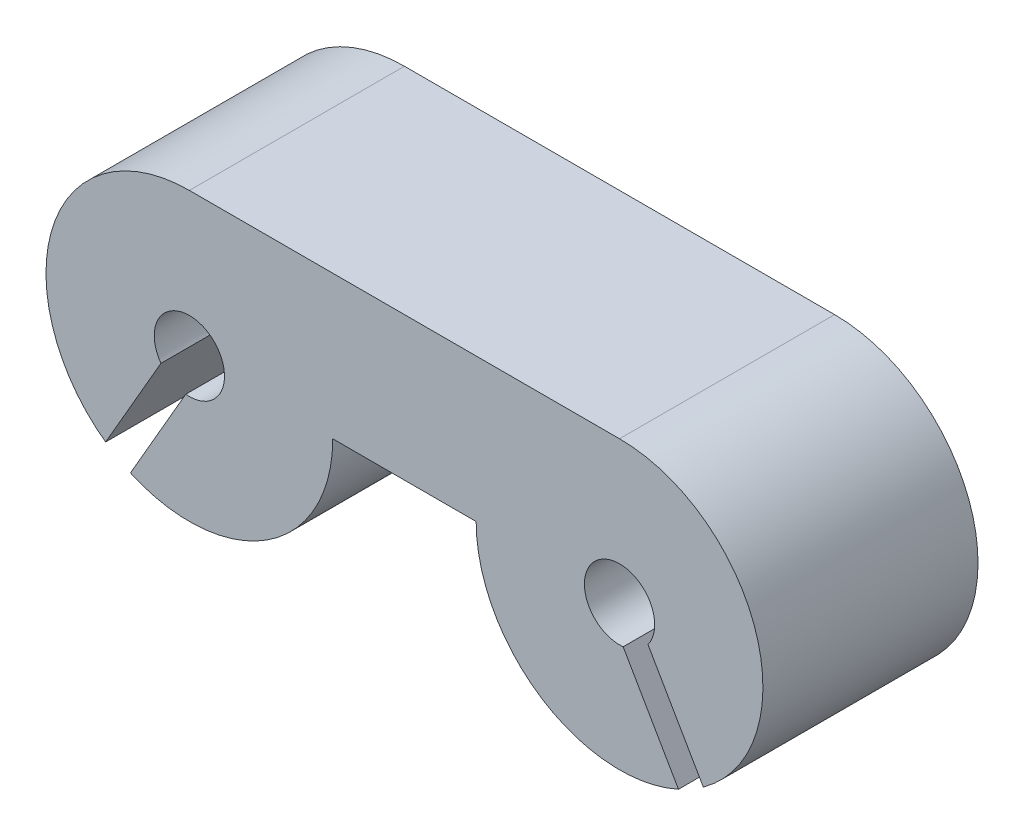
ISO-10303-21;
HEADER;
FILE_DESCRIPTION(('STEP AP214'),'2;1');
FILE_NAME('part.step','',(''),(''),'','','');
FILE_SCHEMA(('AUTOMOTIVE_DESIGN { 1 0 10303 214 1 1 1 1 }'));
ENDSEC;
DATA;
#1=APPLICATION_CONTEXT('core data for automotive mechanical design processes');
#2=APPLICATION_PROTOCOL_DEFINITION('international standard','automotive_design',2000,#1);
#3=PRODUCT_CONTEXT('',#1,'mechanical');
#4=PRODUCT('Part','Part','',(#3));
#5=PRODUCT_RELATED_PRODUCT_CATEGORY('part','',(#4));
#6=PRODUCT_DEFINITION_FORMATION('','',#4);
#7=PRODUCT_DEFINITION_CONTEXT('part definition',#1,'design');
#8=PRODUCT_DEFINITION('design','',#6,#7);
#9=PRODUCT_DEFINITION_SHAPE('','',#8);
#10=(LENGTH_UNIT() NAMED_UNIT(*) SI_UNIT(.MILLI.,.METRE.));
#11=(NAMED_UNIT(*) PLANE_ANGLE_UNIT() SI_UNIT($,.RADIAN.));
#12=(NAMED_UNIT(*) SI_UNIT($,.STERADIAN.) SOLID_ANGLE_UNIT());
#13=UNCERTAINTY_MEASURE_WITH_UNIT(LENGTH_MEASURE(1.E-05),#10,'distance_accuracy_value','');
#14=(GEOMETRIC_REPRESENTATION_CONTEXT(3) GLOBAL_UNCERTAINTY_ASSIGNED_CONTEXT((#13)) GLOBAL_UNIT_ASSIGNED_CONTEXT((#10,
#11,#12)) REPRESENTATION_CONTEXT('',''));
#15=CARTESIAN_POINT('',(0.,0.,0.));
#16=DIRECTION('',(0.,0.,1.));
#17=DIRECTION('',(1.,0.,0.));
#18=AXIS2_PLACEMENT_3D('',#15,#16,#17);
#19=CARTESIAN_POINT('',(15.,0.,15.));
#20=DIRECTION('',(0.,0.,-1.));
#21=DIRECTION('',(-1.,0.,0.));
#22=AXIS2_PLACEMENT_3D('',#19,#20,#21);
#23=CYLINDRICAL_SURFACE('',#22,10.);
#24=CARTESIAN_POINT('',(15.,0.,0.));
#25=DIRECTION('',(0.,0.,1.));
#26=DIRECTION('',(1.,0.,0.));
#27=AXIS2_PLACEMENT_3D('',#24,#25,#26);
#28=CIRCLE('',#27,10.);
#29=CARTESIAN_POINT('',(5.,0.,0.));
#30=VERTEX_POINT('',#29);
#31=CARTESIAN_POINT('',(19.1089117817486,-9.11684396980705,0.));
#32=VERTEX_POINT('',#31);
#33=EDGE_CURVE('E168',#30,#32,#28,.T.);
#34=ORIENTED_EDGE('',*,*,#33,.T.);
#35=DIRECTION('',(0.,0.,-1.));
#36=VECTOR('',#35,1.);
#37=CARTESIAN_POINT('',(19.1089117817486,-9.11684396980705,15.));
#38=LINE('',#37,#36);
#39=CARTESIAN_POINT('',(19.1089117817486,-9.11684396980705,15.));
#40=VERTEX_POINT('',#39);
#41=EDGE_CURVE('E206',#32,#40,#38,.F.);
#42=ORIENTED_EDGE('',*,*,#41,.T.);
#43=CARTESIAN_POINT('',(15.,0.,15.));
#44=DIRECTION('',(0.,0.,1.));
#45=DIRECTION('',(1.,0.,0.));
#46=AXIS2_PLACEMENT_3D('',#43,#44,#45);
#47=CIRCLE('',#46,10.);
#48=CARTESIAN_POINT('',(5.,0.,15.));
#49=VERTEX_POINT('',#48);
#50=EDGE_CURVE('E132',#49,#40,#47,.T.);
#51=ORIENTED_EDGE('',*,*,#50,.F.);
#52=DIRECTION('',(0.,0.,-1.));
#53=VECTOR('',#52,1.);
#54=CARTESIAN_POINT('',(5.,0.,15.));
#55=LINE('',#54,#53);
#56=EDGE_CURVE('E174',#49,#30,#55,.T.);
#57=ORIENTED_EDGE('',*,*,#56,.T.);
#58=EDGE_LOOP('',(#34,#42,#51,#57));
#59=FACE_BOUND('',#58,.T.);
#60=ADVANCED_FACE('F33',(#59),#23,.T.);
#61=CARTESIAN_POINT('',(-15.,0.,15.));
#62=DIRECTION('',(0.,0.,-1.));
#63=DIRECTION('',(-1.,0.,0.));
#64=AXIS2_PLACEMENT_3D('',#61,#62,#63);
#65=CYLINDRICAL_SURFACE('',#64,10.);
#66=CARTESIAN_POINT('',(-15.,0.,15.));
#67=DIRECTION('',(0.,0.,1.));
#68=DIRECTION('',(1.,0.,0.));
#69=AXIS2_PLACEMENT_3D('',#66,#67,#68);
#70=CIRCLE('',#69,10.);
#71=CARTESIAN_POINT('',(-19.1089117817487,-9.11684396980703,15.));
#72=VERTEX_POINT('',#71);
#73=CARTESIAN_POINT('',(-5.,0.,15.));
#74=VERTEX_POINT('',#73);
#75=EDGE_CURVE('E152',#72,#74,#70,.T.);
#76=ORIENTED_EDGE('',*,*,#75,.F.);
#77=DIRECTION('',(0.,0.,-1.));
#78=VECTOR('',#77,1.);
#79=CARTESIAN_POINT('',(-19.1089117817487,-9.11684396980702,15.));
#80=LINE('',#79,#78);
#81=CARTESIAN_POINT('',(-19.1089117817487,-9.11684396980703,0.));
#82=VERTEX_POINT('',#81);
#83=EDGE_CURVE('E136',#72,#82,#80,.T.);
#84=ORIENTED_EDGE('',*,*,#83,.T.);
#85=CARTESIAN_POINT('',(-15.,0.,0.));
#86=DIRECTION('',(0.,0.,1.));
#87=DIRECTION('',(1.,0.,0.));
#88=AXIS2_PLACEMENT_3D('',#85,#86,#87);
#89=CIRCLE('',#88,10.);
#90=CARTESIAN_POINT('',(-5.,0.,0.));
#91=VERTEX_POINT('',#90);
#92=EDGE_CURVE('E147',#82,#91,#89,.T.);
#93=ORIENTED_EDGE('',*,*,#92,.T.);
#94=DIRECTION('',(0.,0.,-1.));
#95=VECTOR('',#94,1.);
#96=CARTESIAN_POINT('',(-5.,0.,15.));
#97=LINE('',#96,#95);
#98=EDGE_CURVE('E177',#74,#91,#97,.T.);
#99=ORIENTED_EDGE('',*,*,#98,.F.);
#100=EDGE_LOOP('',(#76,#84,#93,#99));
#101=FACE_BOUND('',#100,.T.);
#102=ADVANCED_FACE('F234',(#101),#65,.T.);
#103=CARTESIAN_POINT('',(-15.,10.,0.));
#104=VERTEX_POINT('',#103);
#105=CARTESIAN_POINT('',(-20.8409625893176,-8.11684396980702,0.));
#106=VERTEX_POINT('',#105);
#107=EDGE_CURVE('E162',#104,#106,#89,.T.);
#108=ORIENTED_EDGE('',*,*,#107,.T.);
#109=DIRECTION('',(0.,0.,-1.));
#110=VECTOR('',#109,1.);
#111=CARTESIAN_POINT('',(-20.8409625893176,-8.11684396980702,15.));
#112=LINE('',#111,#110);
#113=CARTESIAN_POINT('',(-20.8409625893176,-8.11684396980702,15.));
#114=VERTEX_POINT('',#113);
#115=EDGE_CURVE('E141',#106,#114,#112,.F.);
#116=ORIENTED_EDGE('',*,*,#115,.T.);
#117=CARTESIAN_POINT('',(-15.,10.,15.));
#118=VERTEX_POINT('',#117);
#119=EDGE_CURVE('E154',#118,#114,#70,.T.);
#120=ORIENTED_EDGE('',*,*,#119,.F.);
#121=DIRECTION('',(0.,0.,-1.));
#122=VECTOR('',#121,1.);
#123=CARTESIAN_POINT('',(-15.,10.,15.));
#124=LINE('',#123,#122);
#125=EDGE_CURVE('E180',#118,#104,#124,.T.);
#126=ORIENTED_EDGE('',*,*,#125,.T.);
#127=EDGE_LOOP('',(#108,#116,#120,#126));
#128=FACE_BOUND('',#127,.T.);
#129=ADVANCED_FACE('F35',(#128),#65,.T.);
#130=CARTESIAN_POINT('',(-5.,0.,15.));
#131=DIRECTION('',(0.,1.,0.));
#132=DIRECTION('',(0.,0.,1.));
#133=AXIS2_PLACEMENT_3D('',#130,#131,#132);
#134=PLANE('',#133);
#135=DIRECTION('',(1.,0.,0.));
#136=VECTOR('',#135,1.);
#137=CARTESIAN_POINT('',(-5.,0.,0.));
#138=LINE('',#137,#136);
#139=EDGE_CURVE('E165',#91,#30,#138,.T.);
#140=ORIENTED_EDGE('',*,*,#139,.T.);
#141=ORIENTED_EDGE('',*,*,#56,.F.);
#142=DIRECTION('',(1.,0.,0.));
#143=VECTOR('',#142,1.);
#144=CARTESIAN_POINT('',(-5.,0.,15.));
#145=LINE('',#144,#143);
#146=EDGE_CURVE('E157',#74,#49,#145,.T.);
#147=ORIENTED_EDGE('',*,*,#146,.F.);
#148=ORIENTED_EDGE('',*,*,#98,.T.);
#149=EDGE_LOOP('',(#140,#141,#147,#148));
#150=FACE_BOUND('',#149,.T.);
#151=ADVANCED_FACE('F230',(#150),#134,.F.);
#152=CARTESIAN_POINT('',(20.8409625893175,-8.11684396980705,15.));
#153=VERTEX_POINT('',#152);
#154=CARTESIAN_POINT('',(15.,10.,15.));
#155=VERTEX_POINT('',#154);
#156=EDGE_CURVE('E159',#153,#155,#47,.T.);
#157=ORIENTED_EDGE('',*,*,#156,.F.);
#158=DIRECTION('',(0.,0.,-1.));
#159=VECTOR('',#158,1.);
#160=CARTESIAN_POINT('',(20.8409625893175,-8.11684396980705,15.));
#161=LINE('',#160,#159);
#162=CARTESIAN_POINT('',(20.8409625893175,-8.11684396980705,0.));
#163=VERTEX_POINT('',#162);
#164=EDGE_CURVE('E216',#153,#163,#161,.T.);
#165=ORIENTED_EDGE('',*,*,#164,.T.);
#166=CARTESIAN_POINT('',(15.,10.,0.));
#167=VERTEX_POINT('',#166);
#168=EDGE_CURVE('E167',#163,#167,#28,.T.);
#169=ORIENTED_EDGE('',*,*,#168,.T.);
#170=DIRECTION('',(0.,0.,-1.));
#171=VECTOR('',#170,1.);
#172=CARTESIAN_POINT('',(15.,10.,15.));
#173=LINE('',#172,#171);
#174=EDGE_CURVE('E161',#155,#167,#173,.T.);
#175=ORIENTED_EDGE('',*,*,#174,.F.);
#176=EDGE_LOOP('',(#157,#165,#169,#175));
#177=FACE_BOUND('',#176,.T.);
#178=ADVANCED_FACE('F249',(#177),#23,.T.);
#179=CARTESIAN_POINT('',(5.,10.,15.));
#180=DIRECTION('',(0.,-1.,0.));
#181=DIRECTION('',(1.,0.,0.));
#182=AXIS2_PLACEMENT_3D('',#179,#180,#181);
#183=PLANE('',#182);
#184=DIRECTION('',(-1.,0.,0.));
#185=VECTOR('',#184,1.);
#186=CARTESIAN_POINT('',(5.,10.,0.));
#187=LINE('',#186,#185);
#188=EDGE_CURVE('E153',#167,#104,#187,.T.);
#189=ORIENTED_EDGE('',*,*,#188,.T.);
#190=ORIENTED_EDGE('',*,*,#125,.F.);
#191=DIRECTION('',(-1.,0.,0.));
#192=VECTOR('',#191,1.);
#193=CARTESIAN_POINT('',(-5.,10.,15.));
#194=LINE('',#193,#192);
#195=EDGE_CURVE('E150',#155,#118,#194,.T.);
#196=ORIENTED_EDGE('',*,*,#195,.F.);
#197=ORIENTED_EDGE('',*,*,#174,.T.);
#198=EDGE_LOOP('',(#189,#190,#196,#197));
#199=FACE_BOUND('',#198,.T.);
#200=ADVANCED_FACE('F255',(#199),#183,.F.);
#201=CARTESIAN_POINT('',(15.,0.,15.));
#202=DIRECTION('',(0.,0.,1.));
#203=DIRECTION('',(1.,0.,0.));
#204=AXIS2_PLACEMENT_3D('',#201,#202,#203);
#205=PLANE('',#204);
#206=DIRECTION('',(0.499999999999998,-0.86602540378444,0.));
#207=VECTOR('',#206,1.);
#208=CARTESIAN_POINT('',(14.1339745962156,-0.499999999999997,15.));
#209=LINE('',#208,#207);
#210=CARTESIAN_POINT('',(15.2522880585328,-2.43697573552175,15.));
#211=VERTEX_POINT('',#210);
#212=EDGE_CURVE('E120',#211,#40,#209,.T.);
#213=ORIENTED_EDGE('',*,*,#212,.F.);
#214=CARTESIAN_POINT('',(15.,0.,15.));
#215=DIRECTION('',(0.,0.,1.));
#216=DIRECTION('',(1.,0.,0.));
#217=AXIS2_PLACEMENT_3D('',#214,#215,#216);
#218=CIRCLE('',#217,2.45);
#219=CARTESIAN_POINT('',(16.9843388661017,-1.43697573552175,15.));
#220=VERTEX_POINT('',#219);
#221=EDGE_CURVE('E130',#220,#211,#218,.T.);
#222=ORIENTED_EDGE('',*,*,#221,.F.);
#223=DIRECTION('',(-0.499999999999998,0.86602540378444,0.));
#224=VECTOR('',#223,1.);
#225=CARTESIAN_POINT('',(15.8660254037844,0.499999999999998,15.));
#226=LINE('',#225,#224);
#227=EDGE_CURVE('E48',#153,#220,#226,.T.);
#228=ORIENTED_EDGE('',*,*,#227,.F.);
#229=ORIENTED_EDGE('',*,*,#156,.T.);
#230=ORIENTED_EDGE('',*,*,#195,.T.);
#231=ORIENTED_EDGE('',*,*,#119,.T.);
#232=DIRECTION('',(-0.500000000000004,-0.866025403784436,0.));
#233=VECTOR('',#232,1.);
#234=CARTESIAN_POINT('',(-15.8660254037844,0.500000000000004,15.));
#235=LINE('',#234,#233);
#236=CARTESIAN_POINT('',(-16.9843388661017,-1.43697573552174,15.));
#237=VERTEX_POINT('',#236);
#238=EDGE_CURVE('E198',#237,#114,#235,.T.);
#239=ORIENTED_EDGE('',*,*,#238,.F.);
#240=CARTESIAN_POINT('',(-15.,0.,15.));
#241=DIRECTION('',(0.,0.,1.));
#242=DIRECTION('',(1.,0.,0.));
#243=AXIS2_PLACEMENT_3D('',#240,#241,#242);
#244=CIRCLE('',#243,2.45);
#245=CARTESIAN_POINT('',(-15.2522880585328,-2.43697573552174,15.));
#246=VERTEX_POINT('',#245);
#247=EDGE_CURVE('E138',#246,#237,#244,.T.);
#248=ORIENTED_EDGE('',*,*,#247,.F.);
#249=DIRECTION('',(0.500000000000004,0.866025403784436,0.));
#250=VECTOR('',#249,1.);
#251=CARTESIAN_POINT('',(-14.1339745962156,-0.500000000000002,15.));
#252=LINE('',#251,#250);
#253=EDGE_CURVE('E196',#72,#246,#252,.T.);
#254=ORIENTED_EDGE('',*,*,#253,.F.);
#255=ORIENTED_EDGE('',*,*,#75,.T.);
#256=ORIENTED_EDGE('',*,*,#146,.T.);
#257=ORIENTED_EDGE('',*,*,#50,.T.);
#258=EDGE_LOOP('',(#213,#222,#228,#229,#230,#231,#239,#248,#254,#255,#256,#257));
#259=FACE_BOUND('',#258,.T.);
#260=ADVANCED_FACE('F129',(#259),#205,.T.);
#261=CARTESIAN_POINT('',(15.,0.,0.));
#262=DIRECTION('',(0.,0.,1.));
#263=DIRECTION('',(1.,0.,0.));
#264=AXIS2_PLACEMENT_3D('',#261,#262,#263);
#265=PLANE('',#264);
#266=CARTESIAN_POINT('',(15.,0.,0.));
#267=DIRECTION('',(0.,0.,1.));
#268=DIRECTION('',(1.,0.,0.));
#269=AXIS2_PLACEMENT_3D('',#266,#267,#268);
#270=CIRCLE('',#269,2.45);
#271=CARTESIAN_POINT('',(16.9843388661017,-1.43697573552175,0.));
#272=VERTEX_POINT('',#271);
#273=CARTESIAN_POINT('',(15.2522880585328,-2.43697573552175,0.));
#274=VERTEX_POINT('',#273);
#275=EDGE_CURVE('E135',#272,#274,#270,.T.);
#276=ORIENTED_EDGE('',*,*,#275,.T.);
#277=DIRECTION('',(0.499999999999998,-0.86602540378444,0.));
#278=VECTOR('',#277,1.);
#279=CARTESIAN_POINT('',(14.1339745962156,-0.499999999999997,0.));
#280=LINE('',#279,#278);
#281=EDGE_CURVE('E56',#274,#32,#280,.T.);
#282=ORIENTED_EDGE('',*,*,#281,.T.);
#283=ORIENTED_EDGE('',*,*,#33,.F.);
#284=ORIENTED_EDGE('',*,*,#139,.F.);
#285=ORIENTED_EDGE('',*,*,#92,.F.);
#286=DIRECTION('',(0.500000000000004,0.866025403784436,0.));
#287=VECTOR('',#286,1.);
#288=CARTESIAN_POINT('',(-14.1339745962156,-0.500000000000002,0.));
#289=LINE('',#288,#287);
#290=CARTESIAN_POINT('',(-15.2522880585328,-2.43697573552174,0.));
#291=VERTEX_POINT('',#290);
#292=EDGE_CURVE('E202',#82,#291,#289,.T.);
#293=ORIENTED_EDGE('',*,*,#292,.T.);
#294=CARTESIAN_POINT('',(-15.,0.,0.));
#295=DIRECTION('',(0.,0.,1.));
#296=DIRECTION('',(1.,0.,0.));
#297=AXIS2_PLACEMENT_3D('',#294,#295,#296);
#298=CIRCLE('',#297,2.45);
#299=CARTESIAN_POINT('',(-16.9843388661017,-1.43697573552174,0.));
#300=VERTEX_POINT('',#299);
#301=EDGE_CURVE('E144',#291,#300,#298,.T.);
#302=ORIENTED_EDGE('',*,*,#301,.T.);
#303=DIRECTION('',(-0.500000000000004,-0.866025403784436,0.));
#304=VECTOR('',#303,1.);
#305=CARTESIAN_POINT('',(-15.8660254037844,0.500000000000004,0.));
#306=LINE('',#305,#304);
#307=EDGE_CURVE('E204',#300,#106,#306,.T.);
#308=ORIENTED_EDGE('',*,*,#307,.T.);
#309=ORIENTED_EDGE('',*,*,#107,.F.);
#310=ORIENTED_EDGE('',*,*,#188,.F.);
#311=ORIENTED_EDGE('',*,*,#168,.F.);
#312=DIRECTION('',(-0.499999999999998,0.86602540378444,0.));
#313=VECTOR('',#312,1.);
#314=CARTESIAN_POINT('',(15.8660254037844,0.499999999999998,0.));
#315=LINE('',#314,#313);
#316=EDGE_CURVE('E219',#163,#272,#315,.T.);
#317=ORIENTED_EDGE('',*,*,#316,.T.);
#318=EDGE_LOOP('',(#276,#282,#283,#284,#285,#293,#302,#308,#309,#310,#311,#317));
#319=FACE_BOUND('',#318,.T.);
#320=ADVANCED_FACE('F224',(#319),#265,.F.);
#321=CARTESIAN_POINT('',(-15.,0.,0.));
#322=DIRECTION('',(0.,0.,1.));
#323=DIRECTION('',(1.,0.,0.));
#324=AXIS2_PLACEMENT_3D('',#321,#322,#323);
#325=CYLINDRICAL_SURFACE('',#324,2.45);
#326=ORIENTED_EDGE('',*,*,#301,.F.);
#327=DIRECTION('',(0.,0.,1.));
#328=VECTOR('',#327,1.);
#329=CARTESIAN_POINT('',(-15.2522880585328,-2.43697573552174,0.));
#330=LINE('',#329,#328);
#331=EDGE_CURVE('E186',#291,#246,#330,.T.);
#332=ORIENTED_EDGE('',*,*,#331,.T.);
#333=ORIENTED_EDGE('',*,*,#247,.T.);
#334=DIRECTION('',(0.,0.,1.));
#335=VECTOR('',#334,1.);
#336=CARTESIAN_POINT('',(-16.9843388661017,-1.43697573552174,0.));
#337=LINE('',#336,#335);
#338=EDGE_CURVE('E183',#237,#300,#337,.F.);
#339=ORIENTED_EDGE('',*,*,#338,.T.);
#340=EDGE_LOOP('',(#326,#332,#333,#339));
#341=FACE_BOUND('',#340,.T.);
#342=ADVANCED_FACE('F191',(#341),#325,.F.);
#343=CARTESIAN_POINT('',(15.,0.,0.));
#344=DIRECTION('',(0.,0.,1.));
#345=DIRECTION('',(1.,0.,0.));
#346=AXIS2_PLACEMENT_3D('',#343,#344,#345);
#347=CYLINDRICAL_SURFACE('',#346,2.45);
#348=ORIENTED_EDGE('',*,*,#221,.T.);
#349=DIRECTION('',(0.,0.,1.));
#350=VECTOR('',#349,1.);
#351=CARTESIAN_POINT('',(15.2522880585328,-2.43697573552175,0.));
#352=LINE('',#351,#350);
#353=EDGE_CURVE('E11',#211,#274,#352,.F.);
#354=ORIENTED_EDGE('',*,*,#353,.T.);
#355=ORIENTED_EDGE('',*,*,#275,.F.);
#356=DIRECTION('',(0.,0.,1.));
#357=VECTOR('',#356,1.);
#358=CARTESIAN_POINT('',(16.9843388661017,-1.43697573552175,0.));
#359=LINE('',#358,#357);
#360=EDGE_CURVE('E41',#272,#220,#359,.T.);
#361=ORIENTED_EDGE('',*,*,#360,.T.);
#362=EDGE_LOOP('',(#348,#354,#355,#361));
#363=FACE_BOUND('',#362,.T.);
#364=ADVANCED_FACE('F134',(#363),#347,.F.);
#365=CARTESIAN_POINT('',(-15.8660254037844,0.500000000000004,0.));
#366=DIRECTION('',(-0.866025403784436,0.500000000000004,0.));
#367=DIRECTION('',(-0.500000000000004,-0.866025403784437,0.));
#368=AXIS2_PLACEMENT_3D('',#365,#366,#367);
#369=PLANE('',#368);
#370=ORIENTED_EDGE('',*,*,#307,.F.);
#371=ORIENTED_EDGE('',*,*,#338,.F.);
#372=ORIENTED_EDGE('',*,*,#238,.T.);
#373=ORIENTED_EDGE('',*,*,#115,.F.);
#374=EDGE_LOOP('',(#370,#371,#372,#373));
#375=FACE_BOUND('',#374,.T.);
#376=ADVANCED_FACE('F238',(#375),#369,.F.);
#377=CARTESIAN_POINT('',(-14.1339745962156,-0.500000000000002,0.));
#378=DIRECTION('',(0.866025403784436,-0.500000000000004,0.));
#379=DIRECTION('',(0.500000000000004,0.866025403784436,0.));
#380=AXIS2_PLACEMENT_3D('',#377,#378,#379);
#381=PLANE('',#380);
#382=ORIENTED_EDGE('',*,*,#253,.T.);
#383=ORIENTED_EDGE('',*,*,#331,.F.);
#384=ORIENTED_EDGE('',*,*,#292,.F.);
#385=ORIENTED_EDGE('',*,*,#83,.F.);
#386=EDGE_LOOP('',(#382,#383,#384,#385));
#387=FACE_BOUND('',#386,.T.);
#388=ADVANCED_FACE('F235',(#387),#381,.F.);
#389=CARTESIAN_POINT('',(15.8660254037844,0.499999999999998,0.));
#390=DIRECTION('',(0.86602540378444,0.499999999999998,0.));
#391=DIRECTION('',(-0.499999999999998,0.86602540378444,0.));
#392=AXIS2_PLACEMENT_3D('',#389,#390,#391);
#393=PLANE('',#392);
#394=ORIENTED_EDGE('',*,*,#227,.T.);
#395=ORIENTED_EDGE('',*,*,#360,.F.);
#396=ORIENTED_EDGE('',*,*,#316,.F.);
#397=ORIENTED_EDGE('',*,*,#164,.F.);
#398=EDGE_LOOP('',(#394,#395,#396,#397));
#399=FACE_BOUND('',#398,.T.);
#400=ADVANCED_FACE('F237',(#399),#393,.F.);
#401=CARTESIAN_POINT('',(14.1339745962156,-0.499999999999997,0.));
#402=DIRECTION('',(-0.86602540378444,-0.499999999999998,0.));
#403=DIRECTION('',(0.499999999999998,-0.86602540378444,0.));
#404=AXIS2_PLACEMENT_3D('',#401,#402,#403);
#405=PLANE('',#404);
#406=ORIENTED_EDGE('',*,*,#281,.F.);
#407=ORIENTED_EDGE('',*,*,#353,.F.);
#408=ORIENTED_EDGE('',*,*,#212,.T.);
#409=ORIENTED_EDGE('',*,*,#41,.F.);
#410=EDGE_LOOP('',(#406,#407,#408,#409));
#411=FACE_BOUND('',#410,.T.);
#412=ADVANCED_FACE('F119',(#411),#405,.F.);
#413=CLOSED_SHELL('',(#60,#102,#129,#151,#178,#200,#260,#320,#342,#364,#376,#388,#400,#412));
#414=MANIFOLD_SOLID_BREP('B2',#413);
#415=ADVANCED_BREP_SHAPE_REPRESENTATION('',(#18,#414),#14);
#416=SHAPE_DEFINITION_REPRESENTATION(#9,#415);
ENDSEC;
END-ISO-10303-21;
